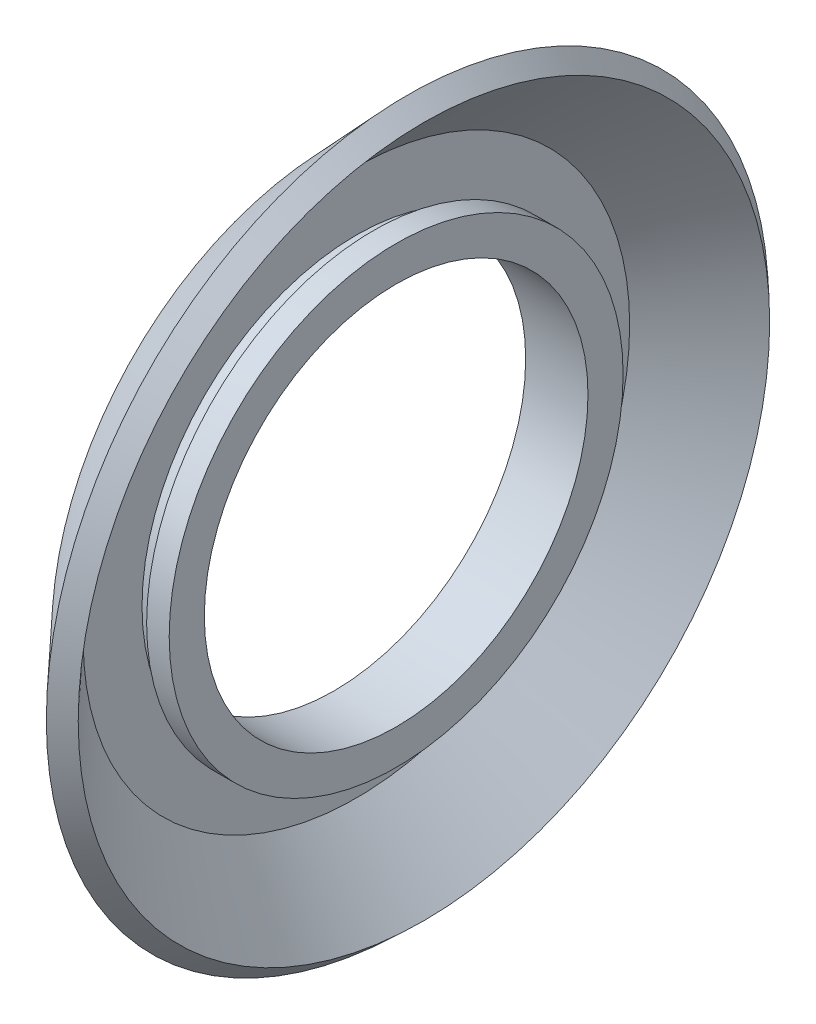
ISO-10303-21;
HEADER;
FILE_DESCRIPTION(('STEP AP214'),'2;1');
FILE_NAME('part.step','',(''),(''),'','','');
FILE_SCHEMA(('AUTOMOTIVE_DESIGN { 1 0 10303 214 1 1 1 1 }'));
ENDSEC;
DATA;
#1=APPLICATION_CONTEXT('core data for automotive mechanical design processes');
#2=APPLICATION_PROTOCOL_DEFINITION('international standard','automotive_design',2000,#1);
#3=PRODUCT_CONTEXT('',#1,'mechanical');
#4=PRODUCT('Part','Part','',(#3));
#5=PRODUCT_RELATED_PRODUCT_CATEGORY('part','',(#4));
#6=PRODUCT_DEFINITION_FORMATION('','',#4);
#7=PRODUCT_DEFINITION_CONTEXT('part definition',#1,'design');
#8=PRODUCT_DEFINITION('design','',#6,#7);
#9=PRODUCT_DEFINITION_SHAPE('','',#8);
#10=(LENGTH_UNIT() NAMED_UNIT(*) SI_UNIT(.MILLI.,.METRE.));
#11=(NAMED_UNIT(*) PLANE_ANGLE_UNIT() SI_UNIT($,.RADIAN.));
#12=(NAMED_UNIT(*) SI_UNIT($,.STERADIAN.) SOLID_ANGLE_UNIT());
#13=UNCERTAINTY_MEASURE_WITH_UNIT(LENGTH_MEASURE(1.E-05),#10,'distance_accuracy_value','');
#14=(GEOMETRIC_REPRESENTATION_CONTEXT(3) GLOBAL_UNCERTAINTY_ASSIGNED_CONTEXT((#13)) GLOBAL_UNIT_ASSIGNED_CONTEXT((#10,
#11,#12)) REPRESENTATION_CONTEXT('',''));
#15=CARTESIAN_POINT('',(0.,0.,0.));
#16=DIRECTION('',(0.,0.,1.));
#17=DIRECTION('',(1.,0.,0.));
#18=AXIS2_PLACEMENT_3D('',#15,#16,#17);
#19=CARTESIAN_POINT('',(1.,0.,0.));
#20=DIRECTION('',(1.,0.,0.));
#21=DIRECTION('',(0.,0.,-1.));
#22=AXIS2_PLACEMENT_3D('',#19,#20,#21);
#23=CONICAL_SURFACE('',#22,12.1064253318839,0.820886216561122);
#24=CARTESIAN_POINT('',(3.99175013826644,0.,0.));
#25=DIRECTION('',(-1.,0.,0.));
#26=DIRECTION('',(0.,0.,1.));
#27=AXIS2_PLACEMENT_3D('',#24,#25,#26);
#28=CIRCLE('',#27,15.3184270140718);
#29=CARTESIAN_POINT('',(3.99175013826644,0.,15.3184270140718));
#30=VERTEX_POINT('',#29);
#31=EDGE_CURVE('E64',#30,#30,#28,.T.);
#32=ORIENTED_EDGE('',*,*,#31,.F.);
#33=EDGE_LOOP('',(#32));
#34=FACE_BOUND('',#33,.T.);
#35=CARTESIAN_POINT('',(1.,0.,0.));
#36=DIRECTION('',(-1.,0.,0.));
#37=DIRECTION('',(0.,0.,1.));
#38=AXIS2_PLACEMENT_3D('',#35,#36,#37);
#39=CIRCLE('',#38,12.1064253318839);
#40=CARTESIAN_POINT('',(1.,0.,12.1064253318839));
#41=VERTEX_POINT('',#40);
#42=EDGE_CURVE('E10',#41,#41,#39,.T.);
#43=ORIENTED_EDGE('',*,*,#42,.T.);
#44=EDGE_LOOP('',(#43));
#45=FACE_BOUND('',#44,.T.);
#46=ADVANCED_FACE('F30',(#34,#45),#23,.F.);
#47=CARTESIAN_POINT('',(1.,8.5,0.));
#48=DIRECTION('',(-1.,0.,0.));
#49=DIRECTION('',(0.,0.,1.));
#50=AXIS2_PLACEMENT_3D('',#47,#48,#49);
#51=PLANE('',#50);
#52=ORIENTED_EDGE('',*,*,#42,.F.);
#53=EDGE_LOOP('',(#52));
#54=FACE_BOUND('',#53,.T.);
#55=CARTESIAN_POINT('',(1.,0.,0.));
#56=DIRECTION('',(-1.,0.,0.));
#57=DIRECTION('',(0.,0.,1.));
#58=AXIS2_PLACEMENT_3D('',#55,#56,#57);
#59=CIRCLE('',#58,9.5);
#60=CARTESIAN_POINT('',(1.,0.,9.5));
#61=VERTEX_POINT('',#60);
#62=EDGE_CURVE('E36',#61,#61,#59,.T.);
#63=ORIENTED_EDGE('',*,*,#62,.T.);
#64=EDGE_LOOP('',(#63));
#65=FACE_BOUND('',#64,.T.);
#66=ADVANCED_FACE('F72',(#54,#65),#51,.F.);
#67=CARTESIAN_POINT('',(-7.89265536723163,0.,0.));
#68=DIRECTION('',(-1.,0.,0.));
#69=DIRECTION('',(0.,0.,1.));
#70=AXIS2_PLACEMENT_3D('',#67,#68,#69);
#71=CYLINDRICAL_SURFACE('',#70,9.5);
#72=ORIENTED_EDGE('',*,*,#62,.F.);
#73=EDGE_LOOP('',(#72));
#74=FACE_BOUND('',#73,.T.);
#75=CARTESIAN_POINT('',(1.76,0.,0.));
#76=DIRECTION('',(-1.,0.,0.));
#77=DIRECTION('',(0.,0.,1.));
#78=AXIS2_PLACEMENT_3D('',#75,#76,#77);
#79=CIRCLE('',#78,9.5);
#80=CARTESIAN_POINT('',(1.76,0.,9.5));
#81=VERTEX_POINT('',#80);
#82=EDGE_CURVE('E40',#81,#81,#79,.T.);
#83=ORIENTED_EDGE('',*,*,#82,.T.);
#84=EDGE_LOOP('',(#83));
#85=FACE_BOUND('',#84,.T.);
#86=ADVANCED_FACE('F76',(#74,#85),#71,.T.);
#87=CARTESIAN_POINT('',(1.76,8.5,0.));
#88=DIRECTION('',(1.,0.,0.));
#89=DIRECTION('',(0.,0.,-1.));
#90=AXIS2_PLACEMENT_3D('',#87,#88,#89);
#91=PLANE('',#90);
#92=ORIENTED_EDGE('',*,*,#82,.F.);
#93=EDGE_LOOP('',(#92));
#94=FACE_BOUND('',#93,.T.);
#95=CARTESIAN_POINT('',(1.76,0.,0.));
#96=DIRECTION('',(-1.,0.,0.));
#97=DIRECTION('',(0.,0.,1.));
#98=AXIS2_PLACEMENT_3D('',#95,#96,#97);
#99=CIRCLE('',#98,10.0562780321022);
#100=CARTESIAN_POINT('',(1.76,0.,10.0562780321022));
#101=VERTEX_POINT('',#100);
#102=EDGE_CURVE('E44',#101,#101,#99,.T.);
#103=ORIENTED_EDGE('',*,*,#102,.T.);
#104=EDGE_LOOP('',(#103));
#105=FACE_BOUND('',#104,.T.);
#106=ADVANCED_FACE('F81',(#94,#105),#91,.F.);
#107=CARTESIAN_POINT('',(-7.89265536723163,0.,0.));
#108=DIRECTION('',(-1.,0.,0.));
#109=DIRECTION('',(0.,0.,1.));
#110=AXIS2_PLACEMENT_3D('',#107,#108,#109);
#111=CYLINDRICAL_SURFACE('',#110,10.0562780321022);
#112=CARTESIAN_POINT('',(2.76,0.,0.));
#113=DIRECTION('',(-1.,0.,0.));
#114=DIRECTION('',(0.,0.,1.));
#115=AXIS2_PLACEMENT_3D('',#112,#113,#114);
#116=CIRCLE('',#115,10.0562780321022);
#117=CARTESIAN_POINT('',(2.76,0.,10.0562780321022));
#118=VERTEX_POINT('',#117);
#119=EDGE_CURVE('E49',#118,#118,#116,.T.);
#120=ORIENTED_EDGE('',*,*,#119,.T.);
#121=EDGE_LOOP('',(#120));
#122=FACE_BOUND('',#121,.T.);
#123=ORIENTED_EDGE('',*,*,#102,.F.);
#124=EDGE_LOOP('',(#123));
#125=FACE_BOUND('',#124,.T.);
#126=ADVANCED_FACE('F87',(#122,#125),#111,.T.);
#127=CARTESIAN_POINT('',(2.76,8.5,0.));
#128=DIRECTION('',(1.,0.,0.));
#129=DIRECTION('',(0.,0.,-1.));
#130=AXIS2_PLACEMENT_3D('',#127,#128,#129);
#131=PLANE('',#130);
#132=CARTESIAN_POINT('',(2.76,0.,0.));
#133=DIRECTION('',(-1.,0.,0.));
#134=DIRECTION('',(0.,0.,1.));
#135=AXIS2_PLACEMENT_3D('',#132,#133,#134);
#136=CIRCLE('',#135,8.5);
#137=CARTESIAN_POINT('',(2.76,0.,8.5));
#138=VERTEX_POINT('',#137);
#139=EDGE_CURVE('E52',#138,#138,#136,.T.);
#140=ORIENTED_EDGE('',*,*,#139,.T.);
#141=EDGE_LOOP('',(#140));
#142=FACE_BOUND('',#141,.T.);
#143=ORIENTED_EDGE('',*,*,#119,.F.);
#144=EDGE_LOOP('',(#143));
#145=FACE_BOUND('',#144,.T.);
#146=ADVANCED_FACE('F91',(#142,#145),#131,.T.);
#147=CARTESIAN_POINT('',(-7.89265536723163,0.,0.));
#148=DIRECTION('',(-1.,0.,0.));
#149=DIRECTION('',(0.,0.,1.));
#150=AXIS2_PLACEMENT_3D('',#147,#148,#149);
#151=CYLINDRICAL_SURFACE('',#150,8.5);
#152=CARTESIAN_POINT('',(0.,0.,0.));
#153=DIRECTION('',(-1.,0.,0.));
#154=DIRECTION('',(0.,0.,1.));
#155=AXIS2_PLACEMENT_3D('',#152,#153,#154);
#156=CIRCLE('',#155,8.5);
#157=CARTESIAN_POINT('',(0.,0.,8.5));
#158=VERTEX_POINT('',#157);
#159=EDGE_CURVE('E55',#158,#158,#156,.T.);
#160=ORIENTED_EDGE('',*,*,#159,.T.);
#161=EDGE_LOOP('',(#160));
#162=FACE_BOUND('',#161,.T.);
#163=ORIENTED_EDGE('',*,*,#139,.F.);
#164=EDGE_LOOP('',(#163));
#165=FACE_BOUND('',#164,.T.);
#166=ADVANCED_FACE('F95',(#162,#165),#151,.F.);
#167=CARTESIAN_POINT('',(0.,8.5,0.));
#168=DIRECTION('',(-1.,0.,0.));
#169=DIRECTION('',(0.,0.,1.));
#170=AXIS2_PLACEMENT_3D('',#167,#168,#169);
#171=PLANE('',#170);
#172=CARTESIAN_POINT('',(0.,0.,0.));
#173=DIRECTION('',(-1.,0.,0.));
#174=DIRECTION('',(0.,0.,1.));
#175=AXIS2_PLACEMENT_3D('',#172,#173,#174);
#176=CIRCLE('',#175,12.5);
#177=CARTESIAN_POINT('',(0.,0.,12.5));
#178=VERTEX_POINT('',#177);
#179=EDGE_CURVE('E58',#178,#178,#176,.T.);
#180=ORIENTED_EDGE('',*,*,#179,.T.);
#181=EDGE_LOOP('',(#180));
#182=FACE_BOUND('',#181,.T.);
#183=ORIENTED_EDGE('',*,*,#159,.F.);
#184=EDGE_LOOP('',(#183));
#185=FACE_BOUND('',#184,.T.);
#186=ADVANCED_FACE('F99',(#182,#185),#171,.T.);
#187=CARTESIAN_POINT('',(0.,0.,0.));
#188=DIRECTION('',(1.,0.,0.));
#189=DIRECTION('',(0.,0.,-1.));
#190=AXIS2_PLACEMENT_3D('',#187,#188,#189);
#191=CONICAL_SURFACE('',#190,12.5,0.820886216561122);
#192=CARTESIAN_POINT('',(3.26,0.,0.));
#193=DIRECTION('',(-1.,0.,0.));
#194=DIRECTION('',(0.,0.,1.));
#195=AXIS2_PLACEMENT_3D('',#192,#193,#194);
#196=CIRCLE('',#195,16.);
#197=CARTESIAN_POINT('',(3.26,0.,16.));
#198=VERTEX_POINT('',#197);
#199=EDGE_CURVE('E61',#198,#198,#196,.T.);
#200=ORIENTED_EDGE('',*,*,#199,.T.);
#201=EDGE_LOOP('',(#200));
#202=FACE_BOUND('',#201,.T.);
#203=ORIENTED_EDGE('',*,*,#179,.F.);
#204=EDGE_LOOP('',(#203));
#205=FACE_BOUND('',#204,.T.);
#206=ADVANCED_FACE('F103',(#202,#205),#191,.T.);
#207=CARTESIAN_POINT('',(3.26,0.,0.));
#208=DIRECTION('',(-1.,0.,0.));
#209=DIRECTION('',(0.,0.,1.));
#210=AXIS2_PLACEMENT_3D('',#207,#208,#209);
#211=CONICAL_SURFACE('',#210,16.,0.749910110233773);
#212=ORIENTED_EDGE('',*,*,#31,.T.);
#213=EDGE_LOOP('',(#212));
#214=FACE_BOUND('',#213,.T.);
#215=ORIENTED_EDGE('',*,*,#199,.F.);
#216=EDGE_LOOP('',(#215));
#217=FACE_BOUND('',#216,.T.);
#218=ADVANCED_FACE('F68',(#214,#217),#211,.T.);
#219=CLOSED_SHELL('',(#46,#66,#86,#106,#126,#146,#166,#186,#206,#218));
#220=MANIFOLD_SOLID_BREP('B2',#219);
#221=ADVANCED_BREP_SHAPE_REPRESENTATION('',(#18,#220),#14);
#222=SHAPE_DEFINITION_REPRESENTATION(#9,#221);
ENDSEC;
END-ISO-10303-21;
